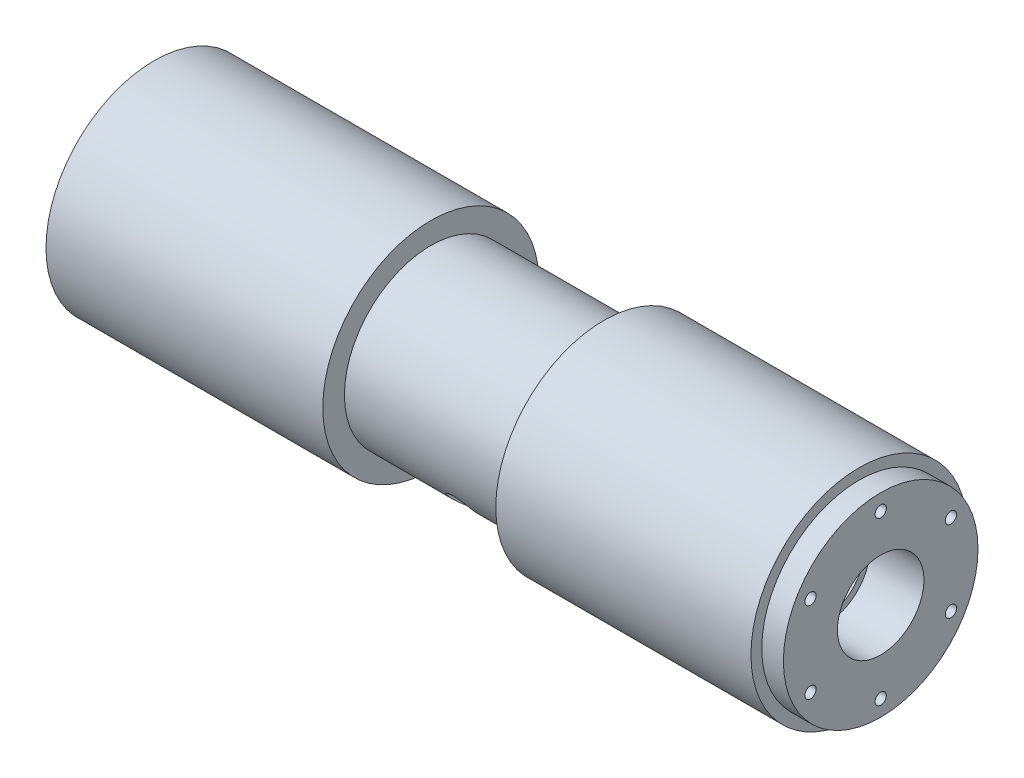
ISO-10303-21;
HEADER;
FILE_DESCRIPTION(('STEP AP214'),'2;1');
FILE_NAME('part.step','',(''),(''),'','','');
FILE_SCHEMA(('AUTOMOTIVE_DESIGN { 1 0 10303 214 1 1 1 1 }'));
ENDSEC;
DATA;
#1=APPLICATION_CONTEXT('core data for automotive mechanical design processes');
#2=APPLICATION_PROTOCOL_DEFINITION('international standard','automotive_design',2000,#1);
#3=PRODUCT_CONTEXT('',#1,'mechanical');
#4=PRODUCT('Part','Part','',(#3));
#5=PRODUCT_RELATED_PRODUCT_CATEGORY('part','',(#4));
#6=PRODUCT_DEFINITION_FORMATION('','',#4);
#7=PRODUCT_DEFINITION_CONTEXT('part definition',#1,'design');
#8=PRODUCT_DEFINITION('design','',#6,#7);
#9=PRODUCT_DEFINITION_SHAPE('','',#8);
#10=(LENGTH_UNIT() NAMED_UNIT(*) SI_UNIT(.MILLI.,.METRE.));
#11=(NAMED_UNIT(*) PLANE_ANGLE_UNIT() SI_UNIT($,.RADIAN.));
#12=(NAMED_UNIT(*) SI_UNIT($,.STERADIAN.) SOLID_ANGLE_UNIT());
#13=UNCERTAINTY_MEASURE_WITH_UNIT(LENGTH_MEASURE(1.E-05),#10,'distance_accuracy_value','');
#14=(GEOMETRIC_REPRESENTATION_CONTEXT(3) GLOBAL_UNCERTAINTY_ASSIGNED_CONTEXT((#13)) GLOBAL_UNIT_ASSIGNED_CONTEXT((#10,
#11,#12)) REPRESENTATION_CONTEXT('',''));
#15=CARTESIAN_POINT('',(0.,0.,0.));
#16=DIRECTION('',(0.,0.,1.));
#17=DIRECTION('',(1.,0.,0.));
#18=AXIS2_PLACEMENT_3D('',#15,#16,#17);
#19=CARTESIAN_POINT('',(106.68,0.,0.));
#20=DIRECTION('',(-1.,0.,0.));
#21=DIRECTION('',(0.,0.,1.));
#22=AXIS2_PLACEMENT_3D('',#19,#20,#21);
#23=CYLINDRICAL_SURFACE('',#22,31.75);
#24=CARTESIAN_POINT('',(132.08,0.,0.));
#25=DIRECTION('',(-1.,0.,0.));
#26=DIRECTION('',(0.,0.,1.));
#27=AXIS2_PLACEMENT_3D('',#24,#25,#26);
#28=CIRCLE('',#27,31.75);
#29=CARTESIAN_POINT('',(132.08,0.,31.75));
#30=VERTEX_POINT('',#29);
#31=EDGE_CURVE('E137',#30,#30,#28,.T.);
#32=ORIENTED_EDGE('',*,*,#31,.F.);
#33=EDGE_LOOP('',(#32));
#34=FACE_BOUND('',#33,.T.);
#35=CARTESIAN_POINT('',(207.01,0.,0.));
#36=DIRECTION('',(1.,0.,0.));
#37=DIRECTION('',(0.,0.,-1.));
#38=AXIS2_PLACEMENT_3D('',#35,#36,#37);
#39=CIRCLE('',#38,31.75);
#40=CARTESIAN_POINT('',(207.01,0.,-31.75));
#41=VERTEX_POINT('',#40);
#42=EDGE_CURVE('E50',#41,#41,#39,.T.);
#43=ORIENTED_EDGE('',*,*,#42,.F.);
#44=EDGE_LOOP('',(#43));
#45=FACE_BOUND('',#44,.T.);
#46=ADVANCED_FACE('F46',(#34,#45),#23,.T.);
#47=CARTESIAN_POINT('',(213.36,0.,0.));
#48=DIRECTION('',(-1.,0.,0.));
#49=DIRECTION('',(0.,0.,-1.));
#50=AXIS2_PLACEMENT_3D('',#47,#48,#49);
#51=PLANE('',#50);
#52=CARTESIAN_POINT('',(213.36,0.,0.));
#53=DIRECTION('',(-1.,0.,0.));
#54=DIRECTION('',(0.,0.,1.));
#55=AXIS2_PLACEMENT_3D('',#52,#53,#54);
#56=CIRCLE('',#55,12.7);
#57=CARTESIAN_POINT('',(213.36,0.,12.7));
#58=VERTEX_POINT('',#57);
#59=EDGE_CURVE('E134',#58,#58,#56,.T.);
#60=ORIENTED_EDGE('',*,*,#59,.T.);
#61=EDGE_LOOP('',(#60));
#62=FACE_BOUND('',#61,.T.);
#63=CARTESIAN_POINT('',(213.36,-11.90625,20.6222299276169));
#64=DIRECTION('',(1.,0.,0.));
#65=DIRECTION('',(0.,0.,-1.));
#66=AXIS2_PLACEMENT_3D('',#63,#64,#65);
#67=CIRCLE('',#66,1.64999999999999);
#68=CARTESIAN_POINT('',(213.36,-11.90625,18.9722299276169));
#69=VERTEX_POINT('',#68);
#70=EDGE_CURVE('E115',#69,#69,#67,.T.);
#71=ORIENTED_EDGE('',*,*,#70,.F.);
#72=EDGE_LOOP('',(#71));
#73=FACE_BOUND('',#72,.T.);
#74=CARTESIAN_POINT('',(213.36,11.90625,20.6222299276169));
#75=DIRECTION('',(1.,0.,0.));
#76=DIRECTION('',(0.,0.,-1.));
#77=AXIS2_PLACEMENT_3D('',#74,#75,#76);
#78=CIRCLE('',#77,1.64999999999999);
#79=CARTESIAN_POINT('',(213.36,11.90625,18.9722299276169));
#80=VERTEX_POINT('',#79);
#81=EDGE_CURVE('E109',#80,#80,#78,.T.);
#82=ORIENTED_EDGE('',*,*,#81,.F.);
#83=EDGE_LOOP('',(#82));
#84=FACE_BOUND('',#83,.T.);
#85=CARTESIAN_POINT('',(213.36,23.8125,0.));
#86=DIRECTION('',(1.,0.,0.));
#87=DIRECTION('',(0.,0.,-1.));
#88=AXIS2_PLACEMENT_3D('',#85,#86,#87);
#89=CIRCLE('',#88,1.64999999999999);
#90=CARTESIAN_POINT('',(213.36,23.8125,-1.64999999999999));
#91=VERTEX_POINT('',#90);
#92=EDGE_CURVE('E103',#91,#91,#89,.T.);
#93=ORIENTED_EDGE('',*,*,#92,.F.);
#94=EDGE_LOOP('',(#93));
#95=FACE_BOUND('',#94,.T.);
#96=CARTESIAN_POINT('',(213.36,11.90625,-20.6222299276169));
#97=DIRECTION('',(1.,0.,0.));
#98=DIRECTION('',(0.,0.,-1.));
#99=AXIS2_PLACEMENT_3D('',#96,#97,#98);
#100=CIRCLE('',#99,1.64999999999999);
#101=CARTESIAN_POINT('',(213.36,11.90625,-22.2722299276169));
#102=VERTEX_POINT('',#101);
#103=EDGE_CURVE('E97',#102,#102,#100,.T.);
#104=ORIENTED_EDGE('',*,*,#103,.F.);
#105=EDGE_LOOP('',(#104));
#106=FACE_BOUND('',#105,.T.);
#107=CARTESIAN_POINT('',(213.36,-23.8125,0.));
#108=DIRECTION('',(1.,0.,0.));
#109=DIRECTION('',(0.,0.,-1.));
#110=AXIS2_PLACEMENT_3D('',#107,#108,#109);
#111=CIRCLE('',#110,1.64999999999999);
#112=CARTESIAN_POINT('',(213.36,-23.8125,-1.64999999999999));
#113=VERTEX_POINT('',#112);
#114=EDGE_CURVE('E85',#113,#113,#111,.T.);
#115=ORIENTED_EDGE('',*,*,#114,.F.);
#116=EDGE_LOOP('',(#115));
#117=FACE_BOUND('',#116,.T.);
#118=CARTESIAN_POINT('',(213.36,-11.90625,-20.6222299276169));
#119=DIRECTION('',(1.,0.,0.));
#120=DIRECTION('',(0.,0.,-1.));
#121=AXIS2_PLACEMENT_3D('',#118,#119,#120);
#122=CIRCLE('',#121,1.64999999999999);
#123=CARTESIAN_POINT('',(213.36,-11.90625,-22.2722299276169));
#124=VERTEX_POINT('',#123);
#125=EDGE_CURVE('E86',#124,#124,#122,.T.);
#126=ORIENTED_EDGE('',*,*,#125,.F.);
#127=EDGE_LOOP('',(#126));
#128=FACE_BOUND('',#127,.T.);
#129=CARTESIAN_POINT('',(213.36,0.,0.));
#130=DIRECTION('',(1.,0.,0.));
#131=DIRECTION('',(0.,0.,-1.));
#132=AXIS2_PLACEMENT_3D('',#129,#130,#131);
#133=CIRCLE('',#132,28.575);
#134=CARTESIAN_POINT('',(213.36,0.,-28.575));
#135=VERTEX_POINT('',#134);
#136=EDGE_CURVE('E297',#135,#135,#133,.T.);
#137=ORIENTED_EDGE('',*,*,#136,.T.);
#138=EDGE_LOOP('',(#137));
#139=FACE_BOUND('',#138,.T.);
#140=ADVANCED_FACE('F220',(#62,#73,#84,#95,#106,#117,#128,#139),#51,.F.);
#141=CARTESIAN_POINT('',(132.08,0.,0.));
#142=DIRECTION('',(-1.,0.,0.));
#143=DIRECTION('',(0.,0.,1.));
#144=AXIS2_PLACEMENT_3D('',#141,#142,#143);
#145=CYLINDRICAL_SURFACE('',#144,25.4);
#146=CARTESIAN_POINT('',(105.25125,-17.4625,-18.4450831863128));
#147=CARTESIAN_POINT('',(105.25124948758,-17.6213523894051,-18.2946920930693));
#148=CARTESIAN_POINT('',(105.26078142255,-17.778307834656,-18.1421957824317));
#149=CARTESIAN_POINT('',(105.297641695359,-18.0872516469984,-17.8342081952259));
#150=CARTESIAN_POINT('',(105.324984424895,-18.2392358928102,-17.6787145954368));
#151=CARTESIAN_POINT('',(105.396666042193,-18.5380565638578,-17.365125957606));
#152=CARTESIAN_POINT('',(105.441092138855,-18.6848622845046,-17.2070216221662));
#153=CARTESIAN_POINT('',(105.546235227686,-18.9717264232753,-16.8902117977765));
#154=CARTESIAN_POINT('',(105.606947617292,-19.1117867345059,-16.7315064911364));
#155=CARTESIAN_POINT('',(105.745364738511,-19.3865303686966,-16.4124158637782));
#156=CARTESIAN_POINT('',(105.823301901362,-19.5211070157966,-16.252039322806));
#157=CARTESIAN_POINT('',(105.995847329213,-19.7820480015786,-15.9333922523259));
#158=CARTESIAN_POINT('',(106.090463960229,-19.9084081753347,-15.7751228227415));
#159=CARTESIAN_POINT('',(106.296527612661,-20.1512773878783,-15.4636606648517));
#160=CARTESIAN_POINT('',(106.407882880124,-20.2678350381507,-15.3104454958175));
#161=CARTESIAN_POINT('',(106.649062497893,-20.4903998409979,-15.0112676777781));
#162=CARTESIAN_POINT('',(106.778862887752,-20.5964203824396,-14.8652959462597));
#163=CARTESIAN_POINT('',(107.033715937125,-20.7777556189835,-14.6104317643845));
#164=CARTESIAN_POINT('',(107.155342736738,-20.8551487236108,-14.4996224455815));
#165=CARTESIAN_POINT('',(107.414106545724,-20.9996956833508,-14.2894727055214));
#166=CARTESIAN_POINT('',(107.551259710367,-21.0668386994412,-14.1901444515686));
#167=CARTESIAN_POINT('',(107.844677698263,-21.1887541493482,-14.0074596189114));
#168=CARTESIAN_POINT('',(108.001196127224,-21.2433280324576,-13.9243621777252));
#169=CARTESIAN_POINT('',(108.247998991705,-21.3113247854398,-13.819883921101));
#170=CARTESIAN_POINT('',(108.332163033549,-21.3316636222637,-13.7884447432147));
#171=CARTESIAN_POINT('',(108.504053434879,-21.3671246844065,-13.7334279614233));
#172=CARTESIAN_POINT('',(108.59177730782,-21.3822504832438,-13.7098449725014));
#173=CARTESIAN_POINT('',(108.799543076844,-21.4107250720438,-13.6653503394583));
#174=CARTESIAN_POINT('',(108.920677034048,-21.4218311815646,-13.6479024883375));
#175=CARTESIAN_POINT('',(109.164655153216,-21.4327411271437,-13.6307637588839));
#176=CARTESIAN_POINT('',(109.287498365298,-21.4325510082784,-13.6310633831467));
#177=CARTESIAN_POINT('',(109.531112266836,-21.4209141804378,-13.6493420639632));
#178=CARTESIAN_POINT('',(109.651885581156,-21.4094829976489,-13.6672967353185));
#179=CARTESIAN_POINT('',(109.888520765461,-21.3763701498939,-13.7190277819027));
#180=CARTESIAN_POINT('',(110.004378043674,-21.3546791219159,-13.7528186087579));
#181=CARTESIAN_POINT('',(110.275508441598,-21.2917826549399,-13.8500736514721));
#182=CARTESIAN_POINT('',(110.427420430438,-21.2462211561798,-13.920025319591));
#183=CARTESIAN_POINT('',(110.716268300087,-21.1416183950195,-14.0783863863286));
#184=CARTESIAN_POINT('',(110.853164709459,-21.0825428078084,-14.1668427357178));
#185=CARTESIAN_POINT('',(111.087424011092,-20.9664008703819,-14.3380130021229));
#186=CARTESIAN_POINT('',(111.187322891918,-20.9111389788883,-14.4185515857921));
#187=CARTESIAN_POINT('',(111.378392838085,-20.7948916198161,-14.5857069240603));
#188=CARTESIAN_POINT('',(111.46955847378,-20.7339026376411,-14.6723274026575));
#189=CARTESIAN_POINT('',(111.643887979814,-20.606921901658,-14.8501424544298));
#190=CARTESIAN_POINT('',(111.727038538118,-20.5409221397799,-14.9413442671677));
#191=CARTESIAN_POINT('',(111.885753192811,-20.4045539177337,-15.1270442902111));
#192=CARTESIAN_POINT('',(111.961314953569,-20.3341841233041,-15.2215435033845));
#193=CARTESIAN_POINT('',(112.144849334432,-20.149741171709,-15.4655237335849));
#194=CARTESIAN_POINT('',(112.24782177529,-20.0328972442018,-15.6166889300463));
#195=CARTESIAN_POINT('',(112.437710489645,-19.7907998261562,-15.9223844825273));
#196=CARTESIAN_POINT('',(112.524618615348,-19.6655421118294,-16.0769165020195));
#197=CARTESIAN_POINT('',(112.682906351795,-19.4072901023589,-16.3877378591776));
#198=CARTESIAN_POINT('',(112.754271087143,-19.2742885490697,-16.5440287310145));
#199=CARTESIAN_POINT('',(112.881371443732,-19.0013285315109,-16.856826603831));
#200=CARTESIAN_POINT('',(112.937109910985,-18.8613713395449,-17.0133335602305));
#201=CARTESIAN_POINT('',(113.03359728214,-18.5720874221807,-17.3287133301469));
#202=CARTESIAN_POINT('',(113.074006102756,-18.4226255125555,-17.4875666316141));
#203=CARTESIAN_POINT('',(113.13736785255,-18.11781656251,-17.8031700135925));
#204=CARTESIAN_POINT('',(113.160317877685,-17.962468547522,-17.9599197399435));
#205=CARTESIAN_POINT('',(113.187603257897,-17.6471405909279,-18.2698434015339));
#206=CARTESIAN_POINT('',(113.191971774701,-17.4871694144296,-18.4230232213679));
#207=CARTESIAN_POINT('',(113.18079364167,-17.1637154624376,-18.7247381810134));
#208=CARTESIAN_POINT('',(113.165256052631,-17.0002343178948,-18.8732754025104));
#209=CARTESIAN_POINT('',(113.102308521978,-16.6066566510985,-19.2216604538684));
#210=CARTESIAN_POINT('',(113.044780712939,-16.3756040050391,-19.4187591940095));
#211=CARTESIAN_POINT('',(112.883361449549,-15.9165964488144,-19.7967197693713));
#212=CARTESIAN_POINT('',(112.779537171988,-15.6886375416684,-19.9776046759806));
#213=CARTESIAN_POINT('',(112.545721331776,-15.2867452621494,-20.2861304725784));
#214=CARTESIAN_POINT('',(112.424280964984,-15.1106937502175,-20.4173965543618));
#215=CARTESIAN_POINT('',(112.21666092341,-14.8580958690675,-20.6011635289369));
#216=CARTESIAN_POINT('',(112.143167156252,-14.7757708863667,-20.6602571872058));
#217=CARTESIAN_POINT('',(111.987753217334,-14.6159361008288,-20.773636672864));
#218=CARTESIAN_POINT('',(111.905836928922,-14.5384241050881,-20.8279246946782));
#219=CARTESIAN_POINT('',(111.732974158179,-14.3885536641732,-20.9317443419182));
#220=CARTESIAN_POINT('',(111.641950877972,-14.3162497649645,-20.9812271127362));
#221=CARTESIAN_POINT('',(111.451976955596,-14.178753191625,-21.0743885230925));
#222=CARTESIAN_POINT('',(111.353030624484,-14.1135566952389,-21.1180702851126));
#223=CARTESIAN_POINT('',(111.147837788217,-13.9913806959754,-21.1992133497391));
#224=CARTESIAN_POINT('',(111.041594566726,-13.9343975323397,-21.2366774247606));
#225=CARTESIAN_POINT('',(110.822624281658,-13.8296925023188,-21.305011593781));
#226=CARTESIAN_POINT('',(110.709898552913,-13.7819687380955,-21.3358830391586));
#227=CARTESIAN_POINT('',(110.496239415975,-13.7030903594005,-21.3866120131));
#228=CARTESIAN_POINT('',(110.396050171967,-13.6705266083351,-21.4074251213036));
#229=CARTESIAN_POINT('',(110.192525239267,-13.613300055483,-21.4438619373698));
#230=CARTESIAN_POINT('',(110.089190002152,-13.5886361255522,-21.4594863862172));
#231=CARTESIAN_POINT('',(109.880285316731,-13.5476148413195,-21.4854071805592));
#232=CARTESIAN_POINT('',(109.774717110517,-13.5312529892981,-21.4957064110926));
#233=CARTESIAN_POINT('',(109.562221550087,-13.5070869261377,-21.510899763078));
#234=CARTESIAN_POINT('',(109.455294285483,-13.4992821537016,-21.5157942390521));
#235=CARTESIAN_POINT('',(109.251814518723,-13.4927061730213,-21.5199184549674));
#236=CARTESIAN_POINT('',(109.155298051294,-13.4931067914841,-21.5196675200524));
#237=CARTESIAN_POINT('',(108.962631310042,-13.5009300416112,-21.5147602727695));
#238=CARTESIAN_POINT('',(108.86648116013,-13.5083548684543,-21.5101025832195));
#239=CARTESIAN_POINT('',(108.675335698796,-13.5301266789078,-21.4964145482066));
#240=CARTESIAN_POINT('',(108.580339746357,-13.5444696215394,-21.4873867553777));
#241=CARTESIAN_POINT('',(108.392112354885,-13.5798759553648,-21.4650273446529));
#242=CARTESIAN_POINT('',(108.298881588055,-13.6009418542944,-21.4516941207624));
#243=CARTESIAN_POINT('',(108.025361492226,-13.6731800162091,-21.405780339509));
#244=CARTESIAN_POINT('',(107.848446093637,-13.7337230752556,-21.3670821560799));
#245=CARTESIAN_POINT('',(107.508361877723,-13.8770556266265,-21.2742698337697));
#246=CARTESIAN_POINT('',(107.345195660104,-13.959849313777,-21.2201527879135));
#247=CARTESIAN_POINT('',(107.026434498072,-14.1495521356503,-21.094166153284));
#248=CARTESIAN_POINT('',(106.871858187809,-14.2575979843399,-21.0214358759037));
#249=CARTESIAN_POINT('',(106.583794414656,-14.4900087706832,-20.8619153020798));
#250=CARTESIAN_POINT('',(106.450312112797,-14.6143776884873,-20.7751215752477));
#251=CARTESIAN_POINT('',(106.190164292178,-14.8912198631905,-20.577751180585));
#252=CARTESIAN_POINT('',(106.066405417707,-15.0452651425147,-20.4655594674863));
#253=CARTESIAN_POINT('',(105.846564255485,-15.3629017252414,-20.2282163232684));
#254=CARTESIAN_POINT('',(105.750514640815,-15.5265040267065,-20.1030498274442));
#255=CARTESIAN_POINT('',(105.546182381495,-15.9366021443186,-19.7808124175523));
#256=CARTESIAN_POINT('',(105.453323803505,-16.1859578934974,-19.5775700717046));
#257=CARTESIAN_POINT('',(105.319769896144,-16.6841810439968,-19.1547674008988));
#258=CARTESIAN_POINT('',(105.279061586658,-16.9330485514361,-18.9352111508441));
#259=CARTESIAN_POINT('',(105.258029204291,-17.2257499653617,-18.6664882289782));
#260=CARTESIAN_POINT('',(105.255476559511,-17.2733356420242,-18.6224620073589));
#261=CARTESIAN_POINT('',(105.252087687391,-17.3681696053748,-18.534046362123));
#262=CARTESIAN_POINT('',(105.251250151875,-17.4154181217942,-18.4896572412694));
#263=CARTESIAN_POINT('',(105.25125,-17.4625,-18.4450831863128));
#264=B_SPLINE_CURVE_WITH_KNOTS('',3,(#146,#147,#148,#149,#150,#151,#152,#153,#154,#155,#156,
#157,#158,#159,#160,#161,#162,#163,#164,#165,#166,#167,#168,#169,#170,#171,#172,#173,#174,#175,
#176,#177,#178,#179,#180,#181,#182,#183,#184,#185,#186,#187,#188,#189,#190,#191,#192,#193,#194,
#195,#196,#197,#198,#199,#200,#201,#202,#203,#204,#205,#206,#207,#208,#209,#210,#211,#212,#213,
#214,#215,#216,#217,#218,#219,#220,#221,#222,#223,#224,#225,#226,#227,#228,#229,#230,#231,#232,
#233,#234,#235,#236,#237,#238,#239,#240,#241,#242,#243,#244,#245,#246,#247,#248,#249,#250,#251,
#252,#253,#254,#255,#256,#257,#258,#259,#260,#261,#262,#263),.UNSPECIFIED.,.T.,.F.,(4,2,2,2,2,2,
2,2,2,2,2,2,2,2,2,2,2,2,2,2,2,2,2,2,2,2,2,2,2,2,2,2,2,2,2,2,2,2,2,2,2,2,2,2,2,2,2,2,2,2,2,2,2,2,
2,2,2,2,4),(0.,0.656177762644812,1.31288639685654,1.9729929495331,2.63291314990697,
3.30235052452767,3.97212463302058,4.63835287857265,5.30372346486471,5.84814639826367,
6.39314110576733,6.94623054074586,7.22211633120613,7.49781262504281,7.86470107145799,
8.23139318254368,8.59757952790642,8.96410069719537,9.48119844616073,9.99962446282144,
10.4182005532397,10.8370352150419,11.2565539369503,11.6762013824303,12.3263958077525,
12.9769191111354,13.6280622716174,14.2790867622905,14.943809877862,15.6086435373314,
16.2722901937602,16.9356348809424,17.8593973747105,18.7818238165745,19.5313695894266,
19.9065240301674,20.2815062686566,20.6599709477601,21.0382310795655,21.4163220925084,
21.7943355285663,22.1160493155159,22.4377171392112,22.7592105101298,23.0806827916004,
23.369884560296,23.6591767390896,23.9483001420946,24.2375315175706,24.8076250348198,
25.3778261051165,25.9817528717571,26.5858271719656,27.2649418536531,27.9448540634844,
28.9439434827395,29.9427841819481,30.1374156411594,30.3318985923942),.UNSPECIFIED.);
#265=CARTESIAN_POINT('',(105.25125,-17.4625,-18.4450831863128));
#266=VERTEX_POINT('',#265);
#267=EDGE_CURVE('E121',#266,#266,#264,.T.);
#268=ORIENTED_EDGE('',*,*,#267,.T.);
#269=EDGE_LOOP('',(#268));
#270=FACE_BOUND('',#269,.T.);
#271=CARTESIAN_POINT('',(132.08,0.,0.));
#272=DIRECTION('',(-1.,0.,0.));
#273=DIRECTION('',(0.,0.,1.));
#274=AXIS2_PLACEMENT_3D('',#271,#272,#273);
#275=CIRCLE('',#274,25.4);
#276=CARTESIAN_POINT('',(132.08,0.,25.4));
#277=VERTEX_POINT('',#276);
#278=EDGE_CURVE('E122',#277,#277,#275,.T.);
#279=ORIENTED_EDGE('',*,*,#278,.T.);
#280=EDGE_LOOP('',(#279));
#281=FACE_BOUND('',#280,.T.);
#282=CARTESIAN_POINT('',(81.28,0.,0.));
#283=DIRECTION('',(-1.,0.,0.));
#284=DIRECTION('',(0.,0.,1.));
#285=AXIS2_PLACEMENT_3D('',#282,#283,#284);
#286=CIRCLE('',#285,25.4);
#287=CARTESIAN_POINT('',(81.28,0.,25.4));
#288=VERTEX_POINT('',#287);
#289=EDGE_CURVE('E126',#288,#288,#286,.T.);
#290=ORIENTED_EDGE('',*,*,#289,.F.);
#291=EDGE_LOOP('',(#290));
#292=FACE_BOUND('',#291,.T.);
#293=CARTESIAN_POINT('',(105.25125,-17.4625,18.4450831863128));
#294=CARTESIAN_POINT('',(105.251247084819,-17.2186193710704,18.6759642571582));
#295=CARTESIAN_POINT('',(105.273674952757,-16.9699959148699,18.9021198682376));
#296=CARTESIAN_POINT('',(105.369114352685,-16.4692680127941,19.3399463428713));
#297=CARTESIAN_POINT('',(105.442115152526,-16.2171643165879,19.5516202691336));
#298=CARTESIAN_POINT('',(105.624415771922,-15.7686629443598,19.9141979420071));
#299=CARTESIAN_POINT('',(105.723586884149,-15.5711731027092,20.0688073103523));
#300=CARTESIAN_POINT('',(105.960517072236,-15.1870805437958,20.3610063566003));
#301=CARTESIAN_POINT('',(106.098225072992,-15.0004638086544,20.4986182166493));
#302=CARTESIAN_POINT('',(106.387927905775,-14.6750537788657,20.7324964404598));
#303=CARTESIAN_POINT('',(106.534133153945,-14.5333817344338,20.8318561993392));
#304=CARTESIAN_POINT('',(106.773248761592,-14.3359821904788,20.9677383024216));
#305=CARTESIAN_POINT('',(106.856298950092,-14.2726742323378,21.0108565818063));
#306=CARTESIAN_POINT('',(107.028680984945,-14.1518874384726,21.0924009386746));
#307=CARTESIAN_POINT('',(107.118010108591,-14.0944061022612,21.1308290304034));
#308=CARTESIAN_POINT('',(107.303136520959,-13.9856889011287,21.202943124886));
#309=CARTESIAN_POINT('',(107.398973933359,-13.9344985259758,21.2365948328567));
#310=CARTESIAN_POINT('',(107.595900231212,-13.8396264063365,21.2985433971676));
#311=CARTESIAN_POINT('',(107.696986543337,-13.7959410268735,21.3268428464996));
#312=CARTESIAN_POINT('',(107.903667137936,-13.7167706130698,21.377848912326));
#313=CARTESIAN_POINT('',(108.009260646629,-13.6812841778159,21.4005564843207));
#314=CARTESIAN_POINT('',(108.224063708221,-13.6191182034101,21.4401721489017));
#315=CARTESIAN_POINT('',(108.333272796625,-13.5924375377716,21.457080983308));
#316=CARTESIAN_POINT('',(108.54161375921,-13.5508857863499,21.483342960746));
#317=CARTESIAN_POINT('',(108.640465961601,-13.5350116251361,21.493339983583));
#318=CARTESIAN_POINT('',(108.839486286978,-13.5107616003178,21.508591957213));
#319=CARTESIAN_POINT('',(108.939654826603,-13.5023881717785,21.5138453680268));
#320=CARTESIAN_POINT('',(109.140399082407,-13.4932773626598,21.5195607527143));
#321=CARTESIAN_POINT('',(109.240974437202,-13.4925342644384,21.5200263142716));
#322=CARTESIAN_POINT('',(109.441836098873,-13.498680428692,21.5161715823013));
#323=CARTESIAN_POINT('',(109.542122287694,-13.5055724592329,21.5118495530641));
#324=CARTESIAN_POINT('',(109.735945252414,-13.5262924591628,21.498826790716));
#325=CARTESIAN_POINT('',(109.829543792022,-13.5397074928246,21.4903866546184));
#326=CARTESIAN_POINT('',(110.015103567758,-13.5730667003932,21.4693325663406));
#327=CARTESIAN_POINT('',(110.107064228216,-13.5930131239525,21.4567171760322));
#328=CARTESIAN_POINT('',(110.379470405759,-13.6622888977611,21.4127278981345));
#329=CARTESIAN_POINT('',(110.556643011212,-13.7210770500389,21.3751971728352));
#330=CARTESIAN_POINT('',(110.901323048618,-13.8625466057285,21.2837257668206));
#331=CARTESIAN_POINT('',(111.068530305092,-13.9457273887172,21.2294407208334));
#332=CARTESIAN_POINT('',(111.385708691726,-14.131660506726,21.1061269380726));
#333=CARTESIAN_POINT('',(111.535674699556,-14.234418634154,21.0370938370122));
#334=CARTESIAN_POINT('',(111.828891005824,-14.4654050647871,20.8790158927584));
#335=CARTESIAN_POINT('',(111.970311560925,-14.5950955236634,20.7887267845948));
#336=CARTESIAN_POINT('',(112.228901041825,-14.8677275761014,20.5946280217045));
#337=CARTESIAN_POINT('',(112.346060736234,-15.0106741838564,20.4908132447756));
#338=CARTESIAN_POINT('',(112.572296844417,-15.32787168538,20.2549031773656));
#339=CARTESIAN_POINT('',(112.67736733741,-15.5035583309858,20.1209133130335));
#340=CARTESIAN_POINT('',(112.856683558332,-15.8607748429887,19.8405506823599));
#341=CARTESIAN_POINT('',(112.930899342278,-16.0423102022704,19.694166052124));
#342=CARTESIAN_POINT('',(113.035917816238,-16.3621521654405,19.4286416606171));
#343=CARTESIAN_POINT('',(113.072893459674,-16.5002070620595,19.3115611557768));
#344=CARTESIAN_POINT('',(113.131401288335,-16.7756618580949,19.072765692575));
#345=CARTESIAN_POINT('',(113.152927234861,-16.9130614706813,18.9510488829089));
#346=CARTESIAN_POINT('',(113.18149298911,-17.1860840678468,18.7038083541909));
#347=CARTESIAN_POINT('',(113.188522146246,-17.3217056735163,18.578281904903));
#348=CARTESIAN_POINT('',(113.188966935387,-17.5901288724243,18.3243441347097));
#349=CARTESIAN_POINT('',(113.182383887365,-17.7229307378307,18.1959330947168));
#350=CARTESIAN_POINT('',(113.143001148479,-18.1202729662576,17.8032373497691));
#351=CARTESIAN_POINT('',(113.090176392639,-18.3795485567965,17.5352938436));
#352=CARTESIAN_POINT('',(112.97484853128,-18.7544949100499,17.1307665686647));
#353=CARTESIAN_POINT('',(112.930287989348,-18.8773389971144,16.9952645791602));
#354=CARTESIAN_POINT('',(112.829363574728,-19.1179390418465,16.7241489210352));
#355=CARTESIAN_POINT('',(112.773003179757,-19.2356964863692,16.5885352970203));
#356=CARTESIAN_POINT('',(112.635390868491,-19.4901148723619,16.2893136844858));
#357=CARTESIAN_POINT('',(112.551394964659,-19.6254894067547,16.1258672958893));
#358=CARTESIAN_POINT('',(112.365843637124,-19.8874607208095,15.8016564447403));
#359=CARTESIAN_POINT('',(112.26427591762,-20.0140512664217,15.6408939471848));
#360=CARTESIAN_POINT('',(112.043187793561,-20.2566737867029,15.3253571133533));
#361=CARTESIAN_POINT('',(111.92375792915,-20.3727545244974,15.1705572639493));
#362=CARTESIAN_POINT('',(111.665002426868,-20.5932861982842,14.8698073801212));
#363=CARTESIAN_POINT('',(111.525710395727,-20.6977562587368,14.7238429786384));
#364=CARTESIAN_POINT('',(111.262037076824,-20.8682539668334,14.4807548237674));
#365=CARTESIAN_POINT('',(111.142568232116,-20.9373792747784,14.3805148619791));
#366=CARTESIAN_POINT('',(110.889572804152,-21.0657863831545,14.1917457196635));
#367=CARTESIAN_POINT('',(110.7560388115,-21.1250629525527,14.1032227675213));
#368=CARTESIAN_POINT('',(110.471951023867,-21.231694604797,13.9421884716063));
#369=CARTESIAN_POINT('',(110.321183873045,-21.2788698873092,13.8699203853725));
#370=CARTESIAN_POINT('',(110.084914050766,-21.3367055705831,13.7806483613354));
#371=CARTESIAN_POINT('',(110.004549460038,-21.3538197763381,13.7540950242514));
#372=CARTESIAN_POINT('',(109.840937394848,-21.3832550409996,13.7082871753717));
#373=CARTESIAN_POINT('',(109.757691496047,-21.3955786759321,13.6890287410427));
#374=CARTESIAN_POINT('',(109.554012584395,-21.4189871703898,13.6523873091832));
#375=CARTESIAN_POINT('',(109.432487479324,-21.4274342297613,13.6391013802631));
#376=CARTESIAN_POINT('',(109.188588986026,-21.4330000721877,13.6303535362967));
#377=CARTESIAN_POINT('',(109.066215925723,-21.4301230144343,13.6348850771393));
#378=CARTESIAN_POINT('',(108.824481748431,-21.4133473708921,13.6612143775448));
#379=CARTESIAN_POINT('',(108.705113817151,-21.3994765836627,13.6829685879999));
#380=CARTESIAN_POINT('',(108.471790473202,-21.3618807049839,13.7415883435084));
#381=CARTESIAN_POINT('',(108.357839940648,-21.3381469093783,13.7784672357941));
#382=CARTESIAN_POINT('',(108.084597625356,-21.2690768489791,13.8849569274141));
#383=CARTESIAN_POINT('',(107.929387802047,-21.2188330283878,13.9617978462614));
#384=CARTESIAN_POINT('',(107.635151681915,-21.1045204237972,14.1339981473744));
#385=CARTESIAN_POINT('',(107.496170074191,-21.0404147884924,14.2294068226368));
#386=CARTESIAN_POINT('',(107.257809146729,-20.9143731788966,14.4138516664682));
#387=CARTESIAN_POINT('',(107.155848929632,-20.8542093904514,14.5008288207758));
#388=CARTESIAN_POINT('',(106.961320788451,-20.7278954324505,14.6808188110409));
#389=CARTESIAN_POINT('',(106.868758854783,-20.6617414949906,14.7738354353729));
#390=CARTESIAN_POINT('',(106.69219751793,-20.5241561697753,14.9643863277241));
#391=CARTESIAN_POINT('',(106.608215509525,-20.4527145481633,15.0619292122936));
#392=CARTESIAN_POINT('',(106.448408628792,-20.3052238694037,15.2601824550044));
#393=CARTESIAN_POINT('',(106.372586156678,-20.2291734667613,15.3608937339651));
#394=CARTESIAN_POINT('',(106.192139249471,-20.0332392541745,15.6162320876142));
#395=CARTESIAN_POINT('',(106.09241535555,-19.9106896185099,15.7722936561168));
#396=CARTESIAN_POINT('',(105.909529528735,-19.657084615126,16.0872613042595));
#397=CARTESIAN_POINT('',(105.826376538919,-19.5260247048454,16.2461688696982));
#398=CARTESIAN_POINT('',(105.676448181212,-19.2563714961107,16.5648924514478));
#399=CARTESIAN_POINT('',(105.609650669864,-19.1177886970462,16.7247069363832));
#400=CARTESIAN_POINT('',(105.492472594816,-18.8336731441371,17.0440144504967));
#401=CARTESIAN_POINT('',(105.442084270228,-18.6881437132226,17.2035075960787));
#402=CARTESIAN_POINT('',(105.351686463904,-18.3675054746102,17.5458808630911));
#403=CARTESIAN_POINT('',(105.31452565475,-18.1913259050346,17.7285245679777));
#404=CARTESIAN_POINT('',(105.264309390585,-17.8318506773054,18.0900564886281));
#405=CARTESIAN_POINT('',(105.251252223979,-17.6485555253716,18.2689449701576));
#406=CARTESIAN_POINT('',(105.25125,-17.4625,18.4450831863128));
#407=B_SPLINE_CURVE_WITH_KNOTS('',3,(#293,#294,#295,#296,#297,#298,#299,#300,#301,#302,#303,
#304,#305,#306,#307,#308,#309,#310,#311,#312,#313,#314,#315,#316,#317,#318,#319,#320,#321,#322,
#323,#324,#325,#326,#327,#328,#329,#330,#331,#332,#333,#334,#335,#336,#337,#338,#339,#340,#341,
#342,#343,#344,#345,#346,#347,#348,#349,#350,#351,#352,#353,#354,#355,#356,#357,#358,#359,#360,
#361,#362,#363,#364,#365,#366,#367,#368,#369,#370,#371,#372,#373,#374,#375,#376,#377,#378,#379,
#380,#381,#382,#383,#384,#385,#386,#387,#388,#389,#390,#391,#392,#393,#394,#395,#396,#397,#398,
#399,#400,#401,#402,#403,#404,#405,#406),.UNSPECIFIED.,.T.,.F.,(4,2,2,2,2,2,2,2,2,2,2,2,2,2,2,2,
2,2,2,2,2,2,2,2,2,2,2,2,2,2,2,2,2,2,2,2,2,2,2,2,2,2,2,2,2,2,2,2,2,2,2,2,2,2,2,2,4),(0.,
1.00685304416187,2.01349248810826,2.81959050812342,3.62462518014128,4.30115302515333,
4.63973536164583,4.97817177527035,5.31892701352323,5.65951674190178,6.00004823228624,
6.34053614295309,6.64199821720916,6.94355812378609,7.24489204571379,7.5463352500461,
7.83078387726088,8.11533058235271,8.68381781900796,9.26486999706877,9.84609436052549,
10.4798115110735,11.113769353168,11.8451057792005,12.5771503076132,13.1307110774667,
13.684495253572,14.2386861423381,14.7928232938466,15.9179791696836,16.4824102553975,
17.046675222454,17.730590871658,18.4149870378766,19.0960248466103,19.7759237211319,
20.2866655216479,20.7976777349706,21.3158923106408,21.5745243958401,21.8330172142085,
22.198813184077,22.5644748146785,22.9292147778989,23.2942773118971,23.832214898667,
24.3716005584261,24.8117129958016,25.2521042203507,25.6933712707208,26.1347677717553,
26.8000720087558,27.465734334257,28.1304903825835,28.7949315697994,29.5631101524453,
30.3312341847873),.UNSPECIFIED.);
#408=CARTESIAN_POINT('',(105.25125,-17.4625,18.4450831863128));
#409=VERTEX_POINT('',#408);
#410=EDGE_CURVE('E129',#409,#409,#407,.T.);
#411=ORIENTED_EDGE('',*,*,#410,.T.);
#412=EDGE_LOOP('',(#411));
#413=FACE_BOUND('',#412,.T.);
#414=ADVANCED_FACE('F159',(#270,#281,#292,#413),#145,.T.);
#415=CARTESIAN_POINT('',(106.68,0.,0.));
#416=DIRECTION('',(-1.,0.,0.));
#417=DIRECTION('',(0.,0.,1.));
#418=AXIS2_PLACEMENT_3D('',#415,#416,#417);
#419=CYLINDRICAL_SURFACE('',#418,10.795);
#420=CARTESIAN_POINT('',(15.875,0.,0.));
#421=DIRECTION('',(-1.,0.,0.));
#422=DIRECTION('',(0.,0.,1.));
#423=AXIS2_PLACEMENT_3D('',#420,#421,#422);
#424=CIRCLE('',#423,10.795);
#425=CARTESIAN_POINT('',(15.875,0.,10.795));
#426=VERTEX_POINT('',#425);
#427=EDGE_CURVE('E55',#426,#426,#424,.T.);
#428=ORIENTED_EDGE('',*,*,#427,.T.);
#429=EDGE_LOOP('',(#428));
#430=FACE_BOUND('',#429,.T.);
#431=CARTESIAN_POINT('',(197.485,0.,0.));
#432=DIRECTION('',(1.,0.,0.));
#433=DIRECTION('',(0.,0.,-1.));
#434=AXIS2_PLACEMENT_3D('',#431,#432,#433);
#435=CIRCLE('',#434,10.795);
#436=CARTESIAN_POINT('',(197.485,0.,-10.795));
#437=VERTEX_POINT('',#436);
#438=EDGE_CURVE('E133',#437,#437,#435,.T.);
#439=ORIENTED_EDGE('',*,*,#438,.T.);
#440=EDGE_LOOP('',(#439));
#441=FACE_BOUND('',#440,.T.);
#442=ADVANCED_FACE('F241',(#430,#441),#419,.F.);
#443=CARTESIAN_POINT('',(0.,0.,0.));
#444=DIRECTION('',(1.,0.,0.));
#445=DIRECTION('',(0.,0.,-1.));
#446=AXIS2_PLACEMENT_3D('',#443,#444,#445);
#447=PLANE('',#446);
#448=CARTESIAN_POINT('',(0.,0.,0.));
#449=DIRECTION('',(-1.,0.,0.));
#450=DIRECTION('',(0.,0.,1.));
#451=AXIS2_PLACEMENT_3D('',#448,#449,#450);
#452=CIRCLE('',#451,12.7);
#453=CARTESIAN_POINT('',(0.,0.,12.7));
#454=VERTEX_POINT('',#453);
#455=EDGE_CURVE('E141',#454,#454,#452,.T.);
#456=ORIENTED_EDGE('',*,*,#455,.F.);
#457=EDGE_LOOP('',(#456));
#458=FACE_BOUND('',#457,.T.);
#459=CARTESIAN_POINT('',(0.,0.,0.));
#460=DIRECTION('',(1.,0.,0.));
#461=DIRECTION('',(0.,0.,-1.));
#462=AXIS2_PLACEMENT_3D('',#459,#460,#461);
#463=CIRCLE('',#462,31.75);
#464=CARTESIAN_POINT('',(0.,0.,-31.75));
#465=VERTEX_POINT('',#464);
#466=EDGE_CURVE('E14',#465,#465,#463,.T.);
#467=ORIENTED_EDGE('',*,*,#466,.F.);
#468=EDGE_LOOP('',(#467));
#469=FACE_BOUND('',#468,.T.);
#470=ADVANCED_FACE('F232',(#458,#469),#447,.F.);
#471=CARTESIAN_POINT('',(81.28,0.,0.));
#472=DIRECTION('',(-1.,0.,0.));
#473=DIRECTION('',(0.,0.,1.));
#474=AXIS2_PLACEMENT_3D('',#471,#472,#473);
#475=CIRCLE('',#474,31.75);
#476=CARTESIAN_POINT('',(81.28,0.,31.75));
#477=VERTEX_POINT('',#476);
#478=EDGE_CURVE('E125',#477,#477,#475,.T.);
#479=ORIENTED_EDGE('',*,*,#478,.T.);
#480=EDGE_LOOP('',(#479));
#481=FACE_BOUND('',#480,.T.);
#482=ORIENTED_EDGE('',*,*,#466,.T.);
#483=EDGE_LOOP('',(#482));
#484=FACE_BOUND('',#483,.T.);
#485=ADVANCED_FACE('F48',(#481,#484),#23,.T.);
#486=CARTESIAN_POINT('',(15.875,0.,0.));
#487=DIRECTION('',(-1.,0.,0.));
#488=DIRECTION('',(0.,0.,1.));
#489=AXIS2_PLACEMENT_3D('',#486,#487,#488);
#490=CYLINDRICAL_SURFACE('',#489,12.7);
#491=CARTESIAN_POINT('',(15.875,0.,0.));
#492=DIRECTION('',(-1.,0.,0.));
#493=DIRECTION('',(0.,0.,1.));
#494=AXIS2_PLACEMENT_3D('',#491,#492,#493);
#495=CIRCLE('',#494,12.7);
#496=CARTESIAN_POINT('',(15.875,0.,12.7));
#497=VERTEX_POINT('',#496);
#498=EDGE_CURVE('E138',#497,#497,#495,.T.);
#499=ORIENTED_EDGE('',*,*,#498,.F.);
#500=EDGE_LOOP('',(#499));
#501=FACE_BOUND('',#500,.T.);
#502=ORIENTED_EDGE('',*,*,#455,.T.);
#503=EDGE_LOOP('',(#502));
#504=FACE_BOUND('',#503,.T.);
#505=ADVANCED_FACE('F231',(#501,#504),#490,.F.);
#506=CARTESIAN_POINT('',(15.875,0.,0.));
#507=DIRECTION('',(-1.,0.,0.));
#508=DIRECTION('',(0.,0.,1.));
#509=AXIS2_PLACEMENT_3D('',#506,#507,#508);
#510=PLANE('',#509);
#511=ORIENTED_EDGE('',*,*,#427,.F.);
#512=EDGE_LOOP('',(#511));
#513=FACE_BOUND('',#512,.T.);
#514=ORIENTED_EDGE('',*,*,#498,.T.);
#515=EDGE_LOOP('',(#514));
#516=FACE_BOUND('',#515,.T.);
#517=ADVANCED_FACE('F238',(#513,#516),#510,.T.);
#518=CARTESIAN_POINT('',(197.485,0.,0.));
#519=DIRECTION('',(1.,0.,0.));
#520=DIRECTION('',(0.,0.,-1.));
#521=AXIS2_PLACEMENT_3D('',#518,#519,#520);
#522=CYLINDRICAL_SURFACE('',#521,12.7);
#523=CARTESIAN_POINT('',(197.485,0.,0.));
#524=DIRECTION('',(-1.,0.,0.));
#525=DIRECTION('',(0.,0.,1.));
#526=AXIS2_PLACEMENT_3D('',#523,#524,#525);
#527=CIRCLE('',#526,12.7);
#528=CARTESIAN_POINT('',(197.485,0.,12.7));
#529=VERTEX_POINT('',#528);
#530=EDGE_CURVE('E130',#529,#529,#527,.T.);
#531=ORIENTED_EDGE('',*,*,#530,.T.);
#532=EDGE_LOOP('',(#531));
#533=FACE_BOUND('',#532,.T.);
#534=ORIENTED_EDGE('',*,*,#59,.F.);
#535=EDGE_LOOP('',(#534));
#536=FACE_BOUND('',#535,.T.);
#537=ADVANCED_FACE('F261',(#533,#536),#522,.F.);
#538=CARTESIAN_POINT('',(197.485,0.,0.));
#539=DIRECTION('',(1.,0.,0.));
#540=DIRECTION('',(0.,0.,1.));
#541=AXIS2_PLACEMENT_3D('',#538,#539,#540);
#542=PLANE('',#541);
#543=ORIENTED_EDGE('',*,*,#438,.F.);
#544=EDGE_LOOP('',(#543));
#545=FACE_BOUND('',#544,.T.);
#546=ORIENTED_EDGE('',*,*,#530,.F.);
#547=EDGE_LOOP('',(#546));
#548=FACE_BOUND('',#547,.T.);
#549=ADVANCED_FACE('F256',(#545,#548),#542,.T.);
#550=CARTESIAN_POINT('',(132.08,0.,0.));
#551=DIRECTION('',(-1.,0.,0.));
#552=DIRECTION('',(0.,0.,1.));
#553=AXIS2_PLACEMENT_3D('',#550,#551,#552);
#554=PLANE('',#553);
#555=ORIENTED_EDGE('',*,*,#278,.F.);
#556=EDGE_LOOP('',(#555));
#557=FACE_BOUND('',#556,.T.);
#558=ORIENTED_EDGE('',*,*,#31,.T.);
#559=EDGE_LOOP('',(#558));
#560=FACE_BOUND('',#559,.T.);
#561=ADVANCED_FACE('F249',(#557,#560),#554,.T.);
#562=CARTESIAN_POINT('',(81.28,0.,0.));
#563=DIRECTION('',(-1.,0.,0.));
#564=DIRECTION('',(0.,0.,1.));
#565=AXIS2_PLACEMENT_3D('',#562,#563,#564);
#566=PLANE('',#565);
#567=ORIENTED_EDGE('',*,*,#289,.T.);
#568=EDGE_LOOP('',(#567));
#569=FACE_BOUND('',#568,.T.);
#570=ORIENTED_EDGE('',*,*,#478,.F.);
#571=EDGE_LOOP('',(#570));
#572=FACE_BOUND('',#571,.T.);
#573=ADVANCED_FACE('F167',(#569,#572),#566,.F.);
#574=CARTESIAN_POINT('',(109.22,-17.4625,25.4));
#575=DIRECTION('',(0.,0.,-1.));
#576=DIRECTION('',(-1.,0.,0.));
#577=AXIS2_PLACEMENT_3D('',#574,#575,#576);
#578=CYLINDRICAL_SURFACE('',#577,3.96874999999999);
#579=ORIENTED_EDGE('',*,*,#410,.F.);
#580=EDGE_LOOP('',(#579));
#581=FACE_BOUND('',#580,.T.);
#582=ORIENTED_EDGE('',*,*,#267,.F.);
#583=EDGE_LOOP('',(#582));
#584=FACE_BOUND('',#583,.T.);
#585=ADVANCED_FACE('F162',(#581,#584),#578,.F.);
#586=CARTESIAN_POINT('',(203.454,-11.90625,20.6222299276169));
#587=DIRECTION('',(1.,0.,0.));
#588=DIRECTION('',(0.,0.,-1.));
#589=AXIS2_PLACEMENT_3D('',#586,#587,#588);
#590=CONICAL_SURFACE('',#589,1.64999999999999,1.02974425867664);
#591=CARTESIAN_POINT('',(202.462579978605,-11.90625,20.6222299276169));
#592=VERTEX_POINT('',#591);
#593=VERTEX_LOOP('',#592);
#594=FACE_BOUND('',#593,.T.);
#595=CARTESIAN_POINT('',(203.454,-11.90625,20.6222299276169));
#596=DIRECTION('',(1.,0.,0.));
#597=DIRECTION('',(0.,0.,-1.));
#598=AXIS2_PLACEMENT_3D('',#595,#596,#597);
#599=CIRCLE('',#598,1.64999999999999);
#600=CARTESIAN_POINT('',(203.454,-11.90625,18.9722299276169));
#601=VERTEX_POINT('',#600);
#602=EDGE_CURVE('E118',#601,#601,#599,.T.);
#603=ORIENTED_EDGE('',*,*,#602,.T.);
#604=EDGE_LOOP('',(#603));
#605=FACE_BOUND('',#604,.T.);
#606=ADVANCED_FACE('F166',(#594,#605),#590,.F.);
#607=CARTESIAN_POINT('',(213.36,-11.90625,20.6222299276169));
#608=DIRECTION('',(1.,0.,0.));
#609=DIRECTION('',(0.,0.,-1.));
#610=AXIS2_PLACEMENT_3D('',#607,#608,#609);
#611=CYLINDRICAL_SURFACE('',#610,1.64999999999999);
#612=ORIENTED_EDGE('',*,*,#602,.F.);
#613=EDGE_LOOP('',(#612));
#614=FACE_BOUND('',#613,.T.);
#615=ORIENTED_EDGE('',*,*,#70,.T.);
#616=EDGE_LOOP('',(#615));
#617=FACE_BOUND('',#616,.T.);
#618=ADVANCED_FACE('F172',(#614,#617),#611,.F.);
#619=CARTESIAN_POINT('',(203.454,11.90625,20.6222299276169));
#620=DIRECTION('',(1.,0.,0.));
#621=DIRECTION('',(0.,0.,-1.));
#622=AXIS2_PLACEMENT_3D('',#619,#620,#621);
#623=CONICAL_SURFACE('',#622,1.64999999999999,1.02974425867664);
#624=CARTESIAN_POINT('',(202.462579978605,11.90625,20.6222299276169));
#625=VERTEX_POINT('',#624);
#626=VERTEX_LOOP('',#625);
#627=FACE_BOUND('',#626,.T.);
#628=CARTESIAN_POINT('',(203.454,11.90625,20.6222299276169));
#629=DIRECTION('',(1.,0.,0.));
#630=DIRECTION('',(0.,0.,-1.));
#631=AXIS2_PLACEMENT_3D('',#628,#629,#630);
#632=CIRCLE('',#631,1.64999999999999);
#633=CARTESIAN_POINT('',(203.454,11.90625,18.9722299276169));
#634=VERTEX_POINT('',#633);
#635=EDGE_CURVE('E112',#634,#634,#632,.T.);
#636=ORIENTED_EDGE('',*,*,#635,.T.);
#637=EDGE_LOOP('',(#636));
#638=FACE_BOUND('',#637,.T.);
#639=ADVANCED_FACE('F175',(#627,#638),#623,.F.);
#640=CARTESIAN_POINT('',(213.36,11.90625,20.6222299276169));
#641=DIRECTION('',(1.,0.,0.));
#642=DIRECTION('',(0.,0.,-1.));
#643=AXIS2_PLACEMENT_3D('',#640,#641,#642);
#644=CYLINDRICAL_SURFACE('',#643,1.64999999999999);
#645=ORIENTED_EDGE('',*,*,#635,.F.);
#646=EDGE_LOOP('',(#645));
#647=FACE_BOUND('',#646,.T.);
#648=ORIENTED_EDGE('',*,*,#81,.T.);
#649=EDGE_LOOP('',(#648));
#650=FACE_BOUND('',#649,.T.);
#651=ADVANCED_FACE('F179',(#647,#650),#644,.F.);
#652=CARTESIAN_POINT('',(203.454,23.8125,0.));
#653=DIRECTION('',(1.,0.,0.));
#654=DIRECTION('',(0.,0.,-1.));
#655=AXIS2_PLACEMENT_3D('',#652,#653,#654);
#656=CONICAL_SURFACE('',#655,1.64999999999999,1.02974425867664);
#657=CARTESIAN_POINT('',(202.462579978605,23.8125,0.));
#658=VERTEX_POINT('',#657);
#659=VERTEX_LOOP('',#658);
#660=FACE_BOUND('',#659,.T.);
#661=CARTESIAN_POINT('',(203.454,23.8125,0.));
#662=DIRECTION('',(1.,0.,0.));
#663=DIRECTION('',(0.,0.,-1.));
#664=AXIS2_PLACEMENT_3D('',#661,#662,#663);
#665=CIRCLE('',#664,1.64999999999999);
#666=CARTESIAN_POINT('',(203.454,23.8125,-1.64999999999999));
#667=VERTEX_POINT('',#666);
#668=EDGE_CURVE('E106',#667,#667,#665,.T.);
#669=ORIENTED_EDGE('',*,*,#668,.T.);
#670=EDGE_LOOP('',(#669));
#671=FACE_BOUND('',#670,.T.);
#672=ADVANCED_FACE('F182',(#660,#671),#656,.F.);
#673=CARTESIAN_POINT('',(213.36,23.8125,0.));
#674=DIRECTION('',(1.,0.,0.));
#675=DIRECTION('',(0.,0.,-1.));
#676=AXIS2_PLACEMENT_3D('',#673,#674,#675);
#677=CYLINDRICAL_SURFACE('',#676,1.64999999999999);
#678=ORIENTED_EDGE('',*,*,#668,.F.);
#679=EDGE_LOOP('',(#678));
#680=FACE_BOUND('',#679,.T.);
#681=ORIENTED_EDGE('',*,*,#92,.T.);
#682=EDGE_LOOP('',(#681));
#683=FACE_BOUND('',#682,.T.);
#684=ADVANCED_FACE('F186',(#680,#683),#677,.F.);
#685=CARTESIAN_POINT('',(203.454,11.90625,-20.6222299276169));
#686=DIRECTION('',(1.,0.,0.));
#687=DIRECTION('',(0.,0.,-1.));
#688=AXIS2_PLACEMENT_3D('',#685,#686,#687);
#689=CONICAL_SURFACE('',#688,1.64999999999999,1.02974425867664);
#690=CARTESIAN_POINT('',(202.462579978605,11.90625,-20.6222299276169));
#691=VERTEX_POINT('',#690);
#692=VERTEX_LOOP('',#691);
#693=FACE_BOUND('',#692,.T.);
#694=CARTESIAN_POINT('',(203.454,11.90625,-20.6222299276169));
#695=DIRECTION('',(1.,0.,0.));
#696=DIRECTION('',(0.,0.,-1.));
#697=AXIS2_PLACEMENT_3D('',#694,#695,#696);
#698=CIRCLE('',#697,1.64999999999999);
#699=CARTESIAN_POINT('',(203.454,11.90625,-22.2722299276169));
#700=VERTEX_POINT('',#699);
#701=EDGE_CURVE('E100',#700,#700,#698,.T.);
#702=ORIENTED_EDGE('',*,*,#701,.T.);
#703=EDGE_LOOP('',(#702));
#704=FACE_BOUND('',#703,.T.);
#705=ADVANCED_FACE('F190',(#693,#704),#689,.F.);
#706=CARTESIAN_POINT('',(213.36,11.90625,-20.6222299276169));
#707=DIRECTION('',(1.,0.,0.));
#708=DIRECTION('',(0.,0.,-1.));
#709=AXIS2_PLACEMENT_3D('',#706,#707,#708);
#710=CYLINDRICAL_SURFACE('',#709,1.64999999999999);
#711=ORIENTED_EDGE('',*,*,#701,.F.);
#712=EDGE_LOOP('',(#711));
#713=FACE_BOUND('',#712,.T.);
#714=ORIENTED_EDGE('',*,*,#103,.T.);
#715=EDGE_LOOP('',(#714));
#716=FACE_BOUND('',#715,.T.);
#717=ADVANCED_FACE('F194',(#713,#716),#710,.F.);
#718=CARTESIAN_POINT('',(203.454,-23.8125,0.));
#719=DIRECTION('',(1.,0.,0.));
#720=DIRECTION('',(0.,0.,-1.));
#721=AXIS2_PLACEMENT_3D('',#718,#719,#720);
#722=CONICAL_SURFACE('',#721,1.64999999999999,1.02974425867664);
#723=CARTESIAN_POINT('',(202.462579978605,-23.8125,0.));
#724=VERTEX_POINT('',#723);
#725=VERTEX_LOOP('',#724);
#726=FACE_BOUND('',#725,.T.);
#727=CARTESIAN_POINT('',(203.454,-23.8125,0.));
#728=DIRECTION('',(1.,0.,0.));
#729=DIRECTION('',(0.,0.,-1.));
#730=AXIS2_PLACEMENT_3D('',#727,#728,#729);
#731=CIRCLE('',#730,1.64999999999999);
#732=CARTESIAN_POINT('',(203.454,-23.8125,-1.64999999999999));
#733=VERTEX_POINT('',#732);
#734=EDGE_CURVE('E89',#733,#733,#731,.T.);
#735=ORIENTED_EDGE('',*,*,#734,.T.);
#736=EDGE_LOOP('',(#735));
#737=FACE_BOUND('',#736,.T.);
#738=ADVANCED_FACE('F198',(#726,#737),#722,.F.);
#739=CARTESIAN_POINT('',(213.36,-23.8125,0.));
#740=DIRECTION('',(1.,0.,0.));
#741=DIRECTION('',(0.,0.,-1.));
#742=AXIS2_PLACEMENT_3D('',#739,#740,#741);
#743=CYLINDRICAL_SURFACE('',#742,1.64999999999999);
#744=ORIENTED_EDGE('',*,*,#734,.F.);
#745=EDGE_LOOP('',(#744));
#746=FACE_BOUND('',#745,.T.);
#747=ORIENTED_EDGE('',*,*,#114,.T.);
#748=EDGE_LOOP('',(#747));
#749=FACE_BOUND('',#748,.T.);
#750=ADVANCED_FACE('F79',(#746,#749),#743,.F.);
#751=CARTESIAN_POINT('',(203.454,-11.90625,-20.6222299276169));
#752=DIRECTION('',(1.,0.,0.));
#753=DIRECTION('',(0.,0.,-1.));
#754=AXIS2_PLACEMENT_3D('',#751,#752,#753);
#755=CONICAL_SURFACE('',#754,1.64999999999999,1.02974425867664);
#756=CARTESIAN_POINT('',(202.462579978605,-11.90625,-20.6222299276169));
#757=VERTEX_POINT('',#756);
#758=VERTEX_LOOP('',#757);
#759=FACE_BOUND('',#758,.T.);
#760=CARTESIAN_POINT('',(203.454,-11.90625,-20.6222299276169));
#761=DIRECTION('',(1.,0.,0.));
#762=DIRECTION('',(0.,0.,-1.));
#763=AXIS2_PLACEMENT_3D('',#760,#761,#762);
#764=CIRCLE('',#763,1.64999999999999);
#765=CARTESIAN_POINT('',(203.454,-11.90625,-22.2722299276169));
#766=VERTEX_POINT('',#765);
#767=EDGE_CURVE('E83',#766,#766,#764,.T.);
#768=ORIENTED_EDGE('',*,*,#767,.T.);
#769=EDGE_LOOP('',(#768));
#770=FACE_BOUND('',#769,.T.);
#771=ADVANCED_FACE('F75',(#759,#770),#755,.F.);
#772=CARTESIAN_POINT('',(213.36,-11.90625,-20.6222299276169));
#773=DIRECTION('',(1.,0.,0.));
#774=DIRECTION('',(0.,0.,-1.));
#775=AXIS2_PLACEMENT_3D('',#772,#773,#774);
#776=CYLINDRICAL_SURFACE('',#775,1.64999999999999);
#777=ORIENTED_EDGE('',*,*,#767,.F.);
#778=EDGE_LOOP('',(#777));
#779=FACE_BOUND('',#778,.T.);
#780=ORIENTED_EDGE('',*,*,#125,.T.);
#781=EDGE_LOOP('',(#780));
#782=FACE_BOUND('',#781,.T.);
#783=ADVANCED_FACE('F78',(#779,#782),#776,.F.);
#784=CARTESIAN_POINT('',(207.01,0.,0.));
#785=DIRECTION('',(1.,0.,0.));
#786=DIRECTION('',(0.,0.,-1.));
#787=AXIS2_PLACEMENT_3D('',#784,#785,#786);
#788=PLANE('',#787);
#789=CARTESIAN_POINT('',(207.01,0.,0.));
#790=DIRECTION('',(1.,0.,0.));
#791=DIRECTION('',(0.,0.,-1.));
#792=AXIS2_PLACEMENT_3D('',#789,#790,#791);
#793=CIRCLE('',#792,28.575);
#794=CARTESIAN_POINT('',(207.01,0.,-28.575));
#795=VERTEX_POINT('',#794);
#796=EDGE_CURVE('E298',#795,#795,#793,.T.);
#797=ORIENTED_EDGE('',*,*,#796,.F.);
#798=EDGE_LOOP('',(#797));
#799=FACE_BOUND('',#798,.T.);
#800=ORIENTED_EDGE('',*,*,#42,.T.);
#801=EDGE_LOOP('',(#800));
#802=FACE_BOUND('',#801,.T.);
#803=ADVANCED_FACE('F208',(#799,#802),#788,.T.);
#804=CARTESIAN_POINT('',(207.01,0.,0.));
#805=DIRECTION('',(1.,0.,0.));
#806=DIRECTION('',(0.,0.,-1.));
#807=AXIS2_PLACEMENT_3D('',#804,#805,#806);
#808=CYLINDRICAL_SURFACE('',#807,28.575);
#809=ORIENTED_EDGE('',*,*,#796,.T.);
#810=EDGE_LOOP('',(#809));
#811=FACE_BOUND('',#810,.T.);
#812=ORIENTED_EDGE('',*,*,#136,.F.);
#813=EDGE_LOOP('',(#812));
#814=FACE_BOUND('',#813,.T.);
#815=ADVANCED_FACE('F211',(#811,#814),#808,.T.);
#816=CLOSED_SHELL('',(#46,#140,#414,#442,#470,#485,#505,#517,#537,#549,#561,#573,#585,#606,#618,
#639,#651,#672,#684,#705,#717,#738,#750,#771,#783,#803,#815));
#817=MANIFOLD_SOLID_BREP('B2',#816);
#818=ADVANCED_BREP_SHAPE_REPRESENTATION('',(#18,#817),#14);
#819=SHAPE_DEFINITION_REPRESENTATION(#9,#818);
ENDSEC;
END-ISO-10303-21;
